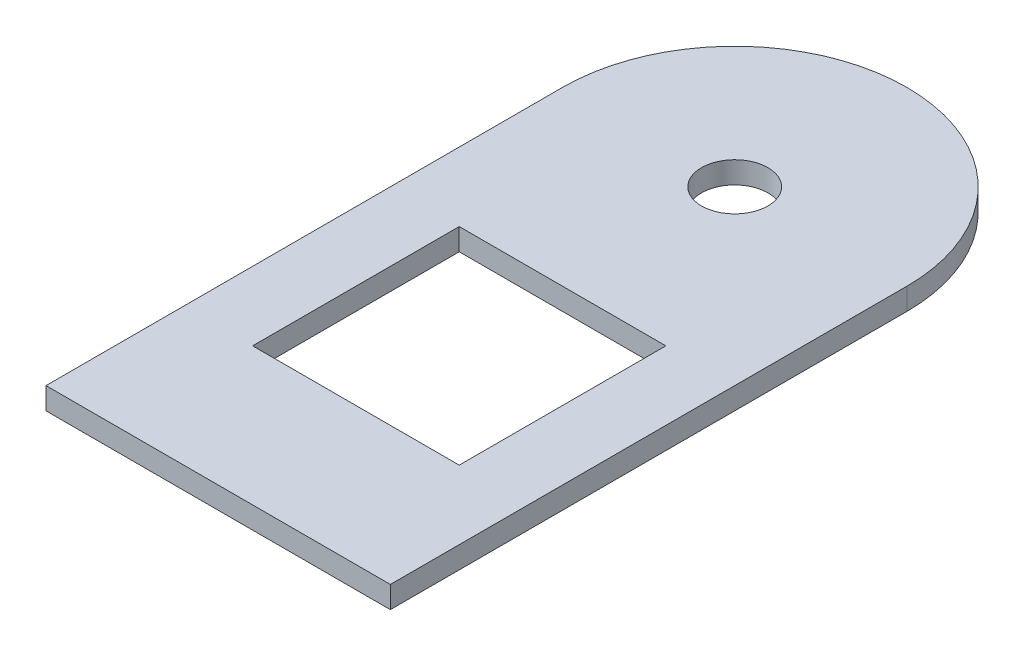
ISO-10303-21;
HEADER;
FILE_DESCRIPTION(('STEP AP214'),'2;1');
FILE_NAME('part.step','',(''),(''),'','','');
FILE_SCHEMA(('AUTOMOTIVE_DESIGN { 1 0 10303 214 1 1 1 1 }'));
ENDSEC;
DATA;
#1=APPLICATION_CONTEXT('core data for automotive mechanical design processes');
#2=APPLICATION_PROTOCOL_DEFINITION('international standard','automotive_design',2000,#1);
#3=PRODUCT_CONTEXT('',#1,'mechanical');
#4=PRODUCT('Part','Part','',(#3));
#5=PRODUCT_RELATED_PRODUCT_CATEGORY('part','',(#4));
#6=PRODUCT_DEFINITION_FORMATION('','',#4);
#7=PRODUCT_DEFINITION_CONTEXT('part definition',#1,'design');
#8=PRODUCT_DEFINITION('design','',#6,#7);
#9=PRODUCT_DEFINITION_SHAPE('','',#8);
#10=(LENGTH_UNIT() NAMED_UNIT(*) SI_UNIT(.MILLI.,.METRE.));
#11=(NAMED_UNIT(*) PLANE_ANGLE_UNIT() SI_UNIT($,.RADIAN.));
#12=(NAMED_UNIT(*) SI_UNIT($,.STERADIAN.) SOLID_ANGLE_UNIT());
#13=UNCERTAINTY_MEASURE_WITH_UNIT(LENGTH_MEASURE(1.E-05),#10,'distance_accuracy_value','');
#14=(GEOMETRIC_REPRESENTATION_CONTEXT(3) GLOBAL_UNCERTAINTY_ASSIGNED_CONTEXT((#13)) GLOBAL_UNIT_ASSIGNED_CONTEXT((#10,
#11,#12)) REPRESENTATION_CONTEXT('',''));
#15=CARTESIAN_POINT('',(0.,0.,0.));
#16=DIRECTION('',(0.,0.,1.));
#17=DIRECTION('',(1.,0.,0.));
#18=AXIS2_PLACEMENT_3D('',#15,#16,#17);
#19=CARTESIAN_POINT('',(9.99999999999999,3.175,0.));
#20=DIRECTION('',(1.,0.,0.));
#21=DIRECTION('',(0.,0.,-1.));
#22=AXIS2_PLACEMENT_3D('',#19,#20,#21);
#23=PLANE('',#22);
#24=DIRECTION('',(0.,0.,1.));
#25=VECTOR('',#24,1.);
#26=CARTESIAN_POINT('',(9.99999999999999,0.,0.));
#27=LINE('',#26,#25);
#28=CARTESIAN_POINT('',(10.,0.,50.));
#29=VERTEX_POINT('',#28);
#30=CARTESIAN_POINT('',(10.,0.,80.));
#31=VERTEX_POINT('',#30);
#32=EDGE_CURVE('E155',#29,#31,#27,.T.);
#33=ORIENTED_EDGE('',*,*,#32,.F.);
#34=DIRECTION('',(0.,-1.,0.));
#35=VECTOR('',#34,1.);
#36=CARTESIAN_POINT('',(10.,3.175,50.));
#37=LINE('',#36,#35);
#38=CARTESIAN_POINT('',(10.,3.175,50.));
#39=VERTEX_POINT('',#38);
#40=EDGE_CURVE('E11',#39,#29,#37,.T.);
#41=ORIENTED_EDGE('',*,*,#40,.F.);
#42=DIRECTION('',(0.,0.,1.));
#43=VECTOR('',#42,1.);
#44=CARTESIAN_POINT('',(9.99999999999999,3.175,0.));
#45=LINE('',#44,#43);
#46=CARTESIAN_POINT('',(10.,3.175,80.));
#47=VERTEX_POINT('',#46);
#48=EDGE_CURVE('E121',#39,#47,#45,.T.);
#49=ORIENTED_EDGE('',*,*,#48,.T.);
#50=DIRECTION('',(0.,-1.,0.));
#51=VECTOR('',#50,1.);
#52=CARTESIAN_POINT('',(10.,3.175,80.));
#53=LINE('',#52,#51);
#54=EDGE_CURVE('E54',#47,#31,#53,.T.);
#55=ORIENTED_EDGE('',*,*,#54,.T.);
#56=EDGE_LOOP('',(#33,#41,#49,#55));
#57=FACE_BOUND('',#56,.T.);
#58=ADVANCED_FACE('F35',(#57),#23,.T.);
#59=CARTESIAN_POINT('',(0.,3.175,50.));
#60=DIRECTION('',(0.,0.,-1.));
#61=DIRECTION('',(-1.,0.,0.));
#62=AXIS2_PLACEMENT_3D('',#59,#60,#61);
#63=PLANE('',#62);
#64=DIRECTION('',(1.,0.,0.));
#65=VECTOR('',#64,1.);
#66=CARTESIAN_POINT('',(0.,0.,50.));
#67=LINE('',#66,#65);
#68=CARTESIAN_POINT('',(40.,0.,50.));
#69=VERTEX_POINT('',#68);
#70=EDGE_CURVE('E126',#29,#69,#67,.T.);
#71=ORIENTED_EDGE('',*,*,#70,.T.);
#72=DIRECTION('',(0.,-1.,0.));
#73=VECTOR('',#72,1.);
#74=CARTESIAN_POINT('',(40.,3.175,50.));
#75=LINE('',#74,#73);
#76=CARTESIAN_POINT('',(40.,3.175,50.));
#77=VERTEX_POINT('',#76);
#78=EDGE_CURVE('E45',#77,#69,#75,.T.);
#79=ORIENTED_EDGE('',*,*,#78,.F.);
#80=DIRECTION('',(1.,0.,0.));
#81=VECTOR('',#80,1.);
#82=CARTESIAN_POINT('',(0.,3.175,50.));
#83=LINE('',#82,#81);
#84=EDGE_CURVE('E115',#39,#77,#83,.T.);
#85=ORIENTED_EDGE('',*,*,#84,.F.);
#86=ORIENTED_EDGE('',*,*,#40,.T.);
#87=EDGE_LOOP('',(#71,#79,#85,#86));
#88=FACE_BOUND('',#87,.T.);
#89=ADVANCED_FACE('F124',(#88),#63,.F.);
#90=CARTESIAN_POINT('',(40.,3.175,0.));
#91=DIRECTION('',(1.,0.,0.));
#92=DIRECTION('',(0.,0.,-1.));
#93=AXIS2_PLACEMENT_3D('',#90,#91,#92);
#94=PLANE('',#93);
#95=DIRECTION('',(0.,0.,1.));
#96=VECTOR('',#95,1.);
#97=CARTESIAN_POINT('',(40.,0.,0.));
#98=LINE('',#97,#96);
#99=CARTESIAN_POINT('',(40.,0.,80.));
#100=VERTEX_POINT('',#99);
#101=EDGE_CURVE('E152',#69,#100,#98,.T.);
#102=ORIENTED_EDGE('',*,*,#101,.T.);
#103=DIRECTION('',(0.,-1.,0.));
#104=VECTOR('',#103,1.);
#105=CARTESIAN_POINT('',(40.,3.175,80.));
#106=LINE('',#105,#104);
#107=CARTESIAN_POINT('',(40.,3.175,80.));
#108=VERTEX_POINT('',#107);
#109=EDGE_CURVE('E80',#108,#100,#106,.T.);
#110=ORIENTED_EDGE('',*,*,#109,.F.);
#111=DIRECTION('',(0.,0.,1.));
#112=VECTOR('',#111,1.);
#113=CARTESIAN_POINT('',(40.,3.175,0.));
#114=LINE('',#113,#112);
#115=EDGE_CURVE('E107',#77,#108,#114,.T.);
#116=ORIENTED_EDGE('',*,*,#115,.F.);
#117=ORIENTED_EDGE('',*,*,#78,.T.);
#118=EDGE_LOOP('',(#102,#110,#116,#117));
#119=FACE_BOUND('',#118,.T.);
#120=ADVANCED_FACE('F109',(#119),#94,.F.);
#121=CARTESIAN_POINT('',(50.,3.175,0.));
#122=DIRECTION('',(1.,0.,0.));
#123=DIRECTION('',(0.,0.,-1.));
#124=AXIS2_PLACEMENT_3D('',#121,#122,#123);
#125=PLANE('',#124);
#126=DIRECTION('',(0.,0.,1.));
#127=VECTOR('',#126,1.);
#128=CARTESIAN_POINT('',(50.,0.,0.));
#129=LINE('',#128,#127);
#130=CARTESIAN_POINT('',(50.,0.,25.));
#131=VERTEX_POINT('',#130);
#132=CARTESIAN_POINT('',(50.,0.,100.));
#133=VERTEX_POINT('',#132);
#134=EDGE_CURVE('E164',#131,#133,#129,.T.);
#135=ORIENTED_EDGE('',*,*,#134,.F.);
#136=DIRECTION('',(0.,-1.,0.));
#137=VECTOR('',#136,1.);
#138=CARTESIAN_POINT('',(50.,3.175,25.));
#139=LINE('',#138,#137);
#140=CARTESIAN_POINT('',(50.,3.175,25.));
#141=VERTEX_POINT('',#140);
#142=EDGE_CURVE('E39',#141,#131,#139,.T.);
#143=ORIENTED_EDGE('',*,*,#142,.F.);
#144=DIRECTION('',(0.,0.,1.));
#145=VECTOR('',#144,1.);
#146=CARTESIAN_POINT('',(50.,3.175,0.));
#147=LINE('',#146,#145);
#148=CARTESIAN_POINT('',(50.,3.175,100.));
#149=VERTEX_POINT('',#148);
#150=EDGE_CURVE('E148',#141,#149,#147,.T.);
#151=ORIENTED_EDGE('',*,*,#150,.T.);
#152=DIRECTION('',(0.,-1.,0.));
#153=VECTOR('',#152,1.);
#154=CARTESIAN_POINT('',(50.,3.175,100.));
#155=LINE('',#154,#153);
#156=EDGE_CURVE('E131',#149,#133,#155,.T.);
#157=ORIENTED_EDGE('',*,*,#156,.T.);
#158=EDGE_LOOP('',(#135,#143,#151,#157));
#159=FACE_BOUND('',#158,.T.);
#160=ADVANCED_FACE('F37',(#159),#125,.T.);
#161=CARTESIAN_POINT('',(25.,3.175,25.));
#162=DIRECTION('',(0.,-1.,0.));
#163=DIRECTION('',(0.,0.,-1.));
#164=AXIS2_PLACEMENT_3D('',#161,#162,#163);
#165=CYLINDRICAL_SURFACE('',#164,25.);
#166=CARTESIAN_POINT('',(25.,0.,25.));
#167=DIRECTION('',(0.,1.,0.));
#168=DIRECTION('',(0.,0.,1.));
#169=AXIS2_PLACEMENT_3D('',#166,#167,#168);
#170=CIRCLE('',#169,25.);
#171=CARTESIAN_POINT('',(0.,0.,25.));
#172=VERTEX_POINT('',#171);
#173=EDGE_CURVE('E162',#131,#172,#170,.T.);
#174=ORIENTED_EDGE('',*,*,#173,.T.);
#175=DIRECTION('',(0.,-1.,0.));
#176=VECTOR('',#175,1.);
#177=CARTESIAN_POINT('',(0.,3.175,25.));
#178=LINE('',#177,#176);
#179=CARTESIAN_POINT('',(0.,3.175,25.));
#180=VERTEX_POINT('',#179);
#181=EDGE_CURVE('E136',#180,#172,#178,.T.);
#182=ORIENTED_EDGE('',*,*,#181,.F.);
#183=CARTESIAN_POINT('',(25.,3.175,25.));
#184=DIRECTION('',(0.,1.,0.));
#185=DIRECTION('',(0.,0.,1.));
#186=AXIS2_PLACEMENT_3D('',#183,#184,#185);
#187=CIRCLE('',#186,25.);
#188=EDGE_CURVE('E175',#141,#180,#187,.T.);
#189=ORIENTED_EDGE('',*,*,#188,.F.);
#190=ORIENTED_EDGE('',*,*,#142,.T.);
#191=EDGE_LOOP('',(#174,#182,#189,#190));
#192=FACE_BOUND('',#191,.T.);
#193=ADVANCED_FACE('F188',(#192),#165,.T.);
#194=CARTESIAN_POINT('',(0.,3.175,0.));
#195=DIRECTION('',(1.,0.,0.));
#196=DIRECTION('',(0.,0.,-1.));
#197=AXIS2_PLACEMENT_3D('',#194,#195,#196);
#198=PLANE('',#197);
#199=DIRECTION('',(0.,0.,1.));
#200=VECTOR('',#199,1.);
#201=CARTESIAN_POINT('',(0.,0.,0.));
#202=LINE('',#201,#200);
#203=CARTESIAN_POINT('',(0.,0.,100.));
#204=VERTEX_POINT('',#203);
#205=EDGE_CURVE('E160',#172,#204,#202,.T.);
#206=ORIENTED_EDGE('',*,*,#205,.T.);
#207=DIRECTION('',(0.,-1.,0.));
#208=VECTOR('',#207,1.);
#209=CARTESIAN_POINT('',(0.,3.175,100.));
#210=LINE('',#209,#208);
#211=CARTESIAN_POINT('',(0.,3.175,100.));
#212=VERTEX_POINT('',#211);
#213=EDGE_CURVE('E133',#212,#204,#210,.T.);
#214=ORIENTED_EDGE('',*,*,#213,.F.);
#215=DIRECTION('',(0.,0.,1.));
#216=VECTOR('',#215,1.);
#217=CARTESIAN_POINT('',(0.,3.175,0.));
#218=LINE('',#217,#216);
#219=EDGE_CURVE('E173',#180,#212,#218,.T.);
#220=ORIENTED_EDGE('',*,*,#219,.F.);
#221=ORIENTED_EDGE('',*,*,#181,.T.);
#222=EDGE_LOOP('',(#206,#214,#220,#221));
#223=FACE_BOUND('',#222,.T.);
#224=ADVANCED_FACE('F189',(#223),#198,.F.);
#225=CARTESIAN_POINT('',(0.,3.175,80.));
#226=DIRECTION('',(0.,0.,-1.));
#227=DIRECTION('',(-1.,0.,0.));
#228=AXIS2_PLACEMENT_3D('',#225,#226,#227);
#229=PLANE('',#228);
#230=DIRECTION('',(1.,0.,0.));
#231=VECTOR('',#230,1.);
#232=CARTESIAN_POINT('',(0.,0.,80.));
#233=LINE('',#232,#231);
#234=EDGE_CURVE('E149',#31,#100,#233,.T.);
#235=ORIENTED_EDGE('',*,*,#234,.F.);
#236=ORIENTED_EDGE('',*,*,#54,.F.);
#237=DIRECTION('',(1.,0.,0.));
#238=VECTOR('',#237,1.);
#239=CARTESIAN_POINT('',(0.,3.175,80.));
#240=LINE('',#239,#238);
#241=EDGE_CURVE('E114',#47,#108,#240,.T.);
#242=ORIENTED_EDGE('',*,*,#241,.T.);
#243=ORIENTED_EDGE('',*,*,#109,.T.);
#244=EDGE_LOOP('',(#235,#236,#242,#243));
#245=FACE_BOUND('',#244,.T.);
#246=ADVANCED_FACE('F191',(#245),#229,.T.);
#247=CARTESIAN_POINT('',(0.,3.175,100.));
#248=DIRECTION('',(0.,0.,-1.));
#249=DIRECTION('',(-1.,0.,0.));
#250=AXIS2_PLACEMENT_3D('',#247,#248,#249);
#251=PLANE('',#250);
#252=DIRECTION('',(1.,0.,0.));
#253=VECTOR('',#252,1.);
#254=CARTESIAN_POINT('',(0.,0.,100.));
#255=LINE('',#254,#253);
#256=EDGE_CURVE('E157',#204,#133,#255,.T.);
#257=ORIENTED_EDGE('',*,*,#256,.T.);
#258=ORIENTED_EDGE('',*,*,#156,.F.);
#259=DIRECTION('',(1.,0.,0.));
#260=VECTOR('',#259,1.);
#261=CARTESIAN_POINT('',(0.,3.175,100.));
#262=LINE('',#261,#260);
#263=EDGE_CURVE('E171',#212,#149,#262,.T.);
#264=ORIENTED_EDGE('',*,*,#263,.F.);
#265=ORIENTED_EDGE('',*,*,#213,.T.);
#266=EDGE_LOOP('',(#257,#258,#264,#265));
#267=FACE_BOUND('',#266,.T.);
#268=ADVANCED_FACE('F183',(#267),#251,.F.);
#269=CARTESIAN_POINT('',(25.,3.175,25.));
#270=DIRECTION('',(0.,-1.,0.));
#271=DIRECTION('',(0.,0.,-1.));
#272=AXIS2_PLACEMENT_3D('',#269,#270,#271);
#273=CYLINDRICAL_SURFACE('',#272,4.82);
#274=CARTESIAN_POINT('',(25.,3.175,25.));
#275=DIRECTION('',(0.,1.,0.));
#276=DIRECTION('',(0.,0.,1.));
#277=AXIS2_PLACEMENT_3D('',#274,#275,#276);
#278=CIRCLE('',#277,4.82);
#279=CARTESIAN_POINT('',(25.,3.175,29.82));
#280=VERTEX_POINT('',#279);
#281=EDGE_CURVE('E134',#280,#280,#278,.T.);
#282=ORIENTED_EDGE('',*,*,#281,.T.);
#283=EDGE_LOOP('',(#282));
#284=FACE_BOUND('',#283,.T.);
#285=CARTESIAN_POINT('',(25.,0.,25.));
#286=DIRECTION('',(0.,1.,0.));
#287=DIRECTION('',(0.,0.,1.));
#288=AXIS2_PLACEMENT_3D('',#285,#286,#287);
#289=CIRCLE('',#288,4.82);
#290=CARTESIAN_POINT('',(25.,0.,29.82));
#291=VERTEX_POINT('',#290);
#292=EDGE_CURVE('E145',#291,#291,#289,.T.);
#293=ORIENTED_EDGE('',*,*,#292,.F.);
#294=EDGE_LOOP('',(#293));
#295=FACE_BOUND('',#294,.T.);
#296=ADVANCED_FACE('F207',(#284,#295),#273,.F.);
#297=CARTESIAN_POINT('',(0.,3.175,0.));
#298=DIRECTION('',(0.,1.,0.));
#299=DIRECTION('',(0.,0.,1.));
#300=AXIS2_PLACEMENT_3D('',#297,#298,#299);
#301=PLANE('',#300);
#302=ORIENTED_EDGE('',*,*,#150,.F.);
#303=ORIENTED_EDGE('',*,*,#188,.T.);
#304=ORIENTED_EDGE('',*,*,#219,.T.);
#305=ORIENTED_EDGE('',*,*,#263,.T.);
#306=EDGE_LOOP('',(#302,#303,#304,#305));
#307=FACE_BOUND('',#306,.T.);
#308=ORIENTED_EDGE('',*,*,#48,.F.);
#309=ORIENTED_EDGE('',*,*,#84,.T.);
#310=ORIENTED_EDGE('',*,*,#115,.T.);
#311=ORIENTED_EDGE('',*,*,#241,.F.);
#312=EDGE_LOOP('',(#308,#309,#310,#311));
#313=FACE_BOUND('',#312,.T.);
#314=ORIENTED_EDGE('',*,*,#281,.F.);
#315=EDGE_LOOP('',(#314));
#316=FACE_BOUND('',#315,.T.);
#317=ADVANCED_FACE('F119',(#307,#313,#316),#301,.T.);
#318=CARTESIAN_POINT('',(0.,0.,0.));
#319=DIRECTION('',(0.,1.,0.));
#320=DIRECTION('',(0.,0.,1.));
#321=AXIS2_PLACEMENT_3D('',#318,#319,#320);
#322=PLANE('',#321);
#323=ORIENTED_EDGE('',*,*,#134,.T.);
#324=ORIENTED_EDGE('',*,*,#256,.F.);
#325=ORIENTED_EDGE('',*,*,#205,.F.);
#326=ORIENTED_EDGE('',*,*,#173,.F.);
#327=EDGE_LOOP('',(#323,#324,#325,#326));
#328=FACE_BOUND('',#327,.T.);
#329=ORIENTED_EDGE('',*,*,#32,.T.);
#330=ORIENTED_EDGE('',*,*,#234,.T.);
#331=ORIENTED_EDGE('',*,*,#101,.F.);
#332=ORIENTED_EDGE('',*,*,#70,.F.);
#333=EDGE_LOOP('',(#329,#330,#331,#332));
#334=FACE_BOUND('',#333,.T.);
#335=ORIENTED_EDGE('',*,*,#292,.T.);
#336=EDGE_LOOP('',(#335));
#337=FACE_BOUND('',#336,.T.);
#338=ADVANCED_FACE('F186',(#328,#334,#337),#322,.F.);
#339=CLOSED_SHELL('',(#58,#89,#120,#160,#193,#224,#246,#268,#296,#317,#338));
#340=MANIFOLD_SOLID_BREP('B2',#339);
#341=ADVANCED_BREP_SHAPE_REPRESENTATION('',(#18,#340),#14);
#342=SHAPE_DEFINITION_REPRESENTATION(#9,#341);
ENDSEC;
END-ISO-10303-21;
